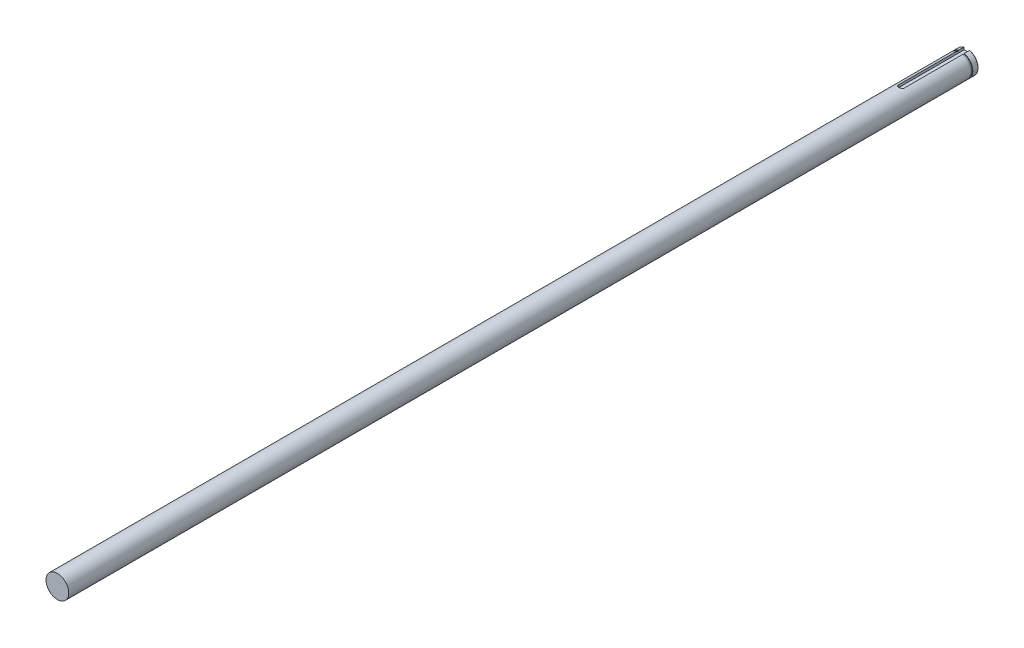
ISO-10303-21;
HEADER;
FILE_DESCRIPTION(('STEP AP214'),'2;1');
FILE_NAME('part.step','',(''),(''),'','','');
FILE_SCHEMA(('AUTOMOTIVE_DESIGN { 1 0 10303 214 1 1 1 1 }'));
ENDSEC;
DATA;
#1=APPLICATION_CONTEXT('core data for automotive mechanical design processes');
#2=APPLICATION_PROTOCOL_DEFINITION('international standard','automotive_design',2000,#1);
#3=PRODUCT_CONTEXT('',#1,'mechanical');
#4=PRODUCT('Part','Part','',(#3));
#5=PRODUCT_RELATED_PRODUCT_CATEGORY('part','',(#4));
#6=PRODUCT_DEFINITION_FORMATION('','',#4);
#7=PRODUCT_DEFINITION_CONTEXT('part definition',#1,'design');
#8=PRODUCT_DEFINITION('design','',#6,#7);
#9=PRODUCT_DEFINITION_SHAPE('','',#8);
#10=(LENGTH_UNIT() NAMED_UNIT(*) SI_UNIT(.MILLI.,.METRE.));
#11=(NAMED_UNIT(*) PLANE_ANGLE_UNIT() SI_UNIT($,.RADIAN.));
#12=(NAMED_UNIT(*) SI_UNIT($,.STERADIAN.) SOLID_ANGLE_UNIT());
#13=UNCERTAINTY_MEASURE_WITH_UNIT(LENGTH_MEASURE(1.E-05),#10,'distance_accuracy_value','');
#14=(GEOMETRIC_REPRESENTATION_CONTEXT(3) GLOBAL_UNCERTAINTY_ASSIGNED_CONTEXT((#13)) GLOBAL_UNIT_ASSIGNED_CONTEXT((#10,
#11,#12)) REPRESENTATION_CONTEXT('',''));
#15=CARTESIAN_POINT('',(0.,0.,0.));
#16=DIRECTION('',(0.,0.,1.));
#17=DIRECTION('',(1.,0.,0.));
#18=AXIS2_PLACEMENT_3D('',#15,#16,#17);
#19=CARTESIAN_POINT('',(0.,0.,508.));
#20=DIRECTION('',(0.,0.,-1.));
#21=DIRECTION('',(-1.,0.,0.));
#22=AXIS2_PLACEMENT_3D('',#19,#20,#21);
#23=CYLINDRICAL_SURFACE('',#22,6.35);
#24=CARTESIAN_POINT('',(0.,0.,508.));
#25=DIRECTION('',(0.,0.,1.));
#26=DIRECTION('',(1.,0.,0.));
#27=AXIS2_PLACEMENT_3D('',#24,#25,#26);
#28=CIRCLE('',#27,6.35);
#29=CARTESIAN_POINT('',(6.35,0.,508.));
#30=VERTEX_POINT('',#29);
#31=EDGE_CURVE('E160',#30,#30,#28,.T.);
#32=ORIENTED_EDGE('',*,*,#31,.F.);
#33=EDGE_LOOP('',(#32));
#34=FACE_BOUND('',#33,.T.);
#35=CARTESIAN_POINT('',(0.,0.,4.16559999999999));
#36=DIRECTION('',(0.,0.,-1.));
#37=DIRECTION('',(-1.,0.,0.));
#38=AXIS2_PLACEMENT_3D('',#35,#36,#37);
#39=CIRCLE('',#38,6.35);
#40=CARTESIAN_POINT('',(1.5875,6.14836106210427,4.1656));
#41=VERTEX_POINT('',#40);
#42=CARTESIAN_POINT('',(-1.5875,6.14836106210428,4.16559999999999));
#43=VERTEX_POINT('',#42);
#44=EDGE_CURVE('E119',#41,#43,#39,.T.);
#45=ORIENTED_EDGE('',*,*,#44,.F.);
#46=DIRECTION('',(0.,0.,-1.));
#47=VECTOR('',#46,1.);
#48=CARTESIAN_POINT('',(1.5875,6.14836106210427,508.));
#49=LINE('',#48,#47);
#50=CARTESIAN_POINT('',(1.5875,6.14836106210427,36.5125));
#51=VERTEX_POINT('',#50);
#52=EDGE_CURVE('E153',#41,#51,#49,.F.);
#53=ORIENTED_EDGE('',*,*,#52,.T.);
#54=CARTESIAN_POINT('',(1.5875,6.14836106210427,36.5125));
#55=CARTESIAN_POINT('',(1.58750053563076,6.14835810796606,36.5564164042586));
#56=CARTESIAN_POINT('',(1.58567649135611,6.1488321882052,36.6003110486267));
#57=CARTESIAN_POINT('',(1.57840509610179,6.15070388893621,36.6877720323265));
#58=CARTESIAN_POINT('',(1.57295835523029,6.15210135391809,36.7313384256906));
#59=CARTESIAN_POINT('',(1.55126429791882,6.15762251223385,36.8608874085666));
#60=CARTESIAN_POINT('',(1.52966278974207,6.16307532290946,36.9459798107256));
#61=CARTESIAN_POINT('',(1.47287988261591,6.17688972981619,37.1111841775605));
#62=CARTESIAN_POINT('',(1.43769952552689,6.18525110287803,37.1912965237924));
#63=CARTESIAN_POINT('',(1.35479829949004,6.20393595252303,37.3445247417086));
#64=CARTESIAN_POINT('',(1.30707369385798,6.2142600134982,37.4176385197897));
#65=CARTESIAN_POINT('',(1.19933256749028,6.23595799608254,37.556349844211));
#66=CARTESIAN_POINT('',(1.13909280637801,6.24734856924931,37.6217713342527));
#67=CARTESIAN_POINT('',(1.00850181854161,6.26975322519149,37.7417030245693));
#68=CARTESIAN_POINT('',(0.938148677552545,6.2807672362014,37.7962111544744));
#69=CARTESIAN_POINT('',(0.788105723384315,6.30136480507554,37.8934975279442));
#70=CARTESIAN_POINT('',(0.708297348786843,6.31092579003164,37.9360979144321));
#71=CARTESIAN_POINT('',(0.542394374747519,6.3273403202671,38.0071884375914));
#72=CARTESIAN_POINT('',(0.4563046932846,6.33419595732182,38.035689480219));
#73=CARTESIAN_POINT('',(0.308130870380598,6.34280700011213,38.0710419259421));
#74=CARTESIAN_POINT('',(0.247023133427687,6.3454886220384,38.0818844479464));
#75=CARTESIAN_POINT('',(0.12395437707704,6.34909193923033,38.0963679483237));
#76=CARTESIAN_POINT('',(0.0619939974411806,6.35001488853225,38.100014058225));
#77=CARTESIAN_POINT('',(0.,6.35,38.1));
#78=B_SPLINE_CURVE_WITH_KNOTS('',3,(#54,#55,#56,#57,#58,#59,#60,#61,#62,#63,#64,#65,#66,#67,#68,
#69,#70,#71,#72,#73,#74,#75,#76,#77),.UNSPECIFIED.,.F.,.F.,(4,2,2,2,2,2,2,2,2,2,2,4),(0.,
0.131665984878253,0.263309801142852,0.525827589053098,0.788325238840119,1.05090117028931,
1.31864004112946,1.58642965659114,1.8580279681483,2.12941586644515,2.3153533887735,
2.50115827710588),.UNSPECIFIED.);
#79=CARTESIAN_POINT('',(0.,6.35,38.1));
#80=VERTEX_POINT('',#79);
#81=EDGE_CURVE('E11',#51,#80,#78,.T.);
#82=ORIENTED_EDGE('',*,*,#81,.T.);
#83=CARTESIAN_POINT('',(0.,6.35,38.1));
#84=CARTESIAN_POINT('',(-0.0439381419439138,6.35000250540312,38.1000004773171));
#85=CARTESIAN_POINT('',(-0.0878545966592341,6.34954340403385,38.0981746816886));
#86=CARTESIAN_POINT('',(-0.175360439570217,6.3477286591364,38.090895931349));
#87=CARTESIAN_POINT('',(-0.218949877602366,6.34637315514478,38.0854435411632));
#88=CARTESIAN_POINT('',(-0.34857618129887,6.34101201422056,38.063725013765));
#89=CARTESIAN_POINT('',(-0.433724473320642,6.33571144551056,38.0420971780461));
#90=CARTESIAN_POINT('',(-0.599043829778521,6.32222636565126,37.9852376852895));
#91=CARTESIAN_POINT('',(-0.679214994295192,6.31404191251351,37.9500063018962));
#92=CARTESIAN_POINT('',(-0.832540768645135,6.29566048497806,37.8669857312186));
#93=CARTESIAN_POINT('',(-0.905693540832324,6.28546298562404,37.8191932672127));
#94=CARTESIAN_POINT('',(-1.0443626413639,6.26393073756774,37.711382214892));
#95=CARTESIAN_POINT('',(-1.1097145404664,6.25257857860382,37.6511557066594));
#96=CARTESIAN_POINT('',(-1.22951149389981,6.23013032507566,37.520620145661));
#97=CARTESIAN_POINT('',(-1.28395413289799,6.21903428769736,37.4503088660052));
#98=CARTESIAN_POINT('',(-1.3811687665937,6.19817637949513,37.300306027469));
#99=CARTESIAN_POINT('',(-1.42375170417231,6.18843723686723,37.2204886309121));
#100=CARTESIAN_POINT('',(-1.49480670969855,6.17166052854814,37.0545680899359));
#101=CARTESIAN_POINT('',(-1.52329018676586,6.164620779582,36.9684700926547));
#102=CARTESIAN_POINT('',(-1.55859600850025,6.15576968025138,36.8203439536311));
#103=CARTESIAN_POINT('',(-1.56941770251178,6.15300939882428,36.7592962159982));
#104=CARTESIAN_POINT('',(-1.58387443533482,6.14929724452326,36.6363433418623));
#105=CARTESIAN_POINT('',(-1.58751417787204,6.14834418804682,36.5744387932915));
#106=CARTESIAN_POINT('',(-1.5875,6.14836106210428,36.5125));
#107=B_SPLINE_CURVE_WITH_KNOTS('',3,(#83,#84,#85,#86,#87,#88,#89,#90,#91,#92,#93,#94,#95,#96,
#97,#98,#99,#100,#101,#102,#103,#104,#105,#106),.UNSPECIFIED.,.F.,.F.,(4,2,2,2,2,2,2,2,2,2,2,4),
(0.,0.131731399473638,0.263442298089413,0.526113689422091,0.788779797220858,1.05151449302482,
1.31906192516595,1.58666852757008,1.85832436810619,2.1297600270756,2.31551982828806,
2.50115792810002),.UNSPECIFIED.);
#108=CARTESIAN_POINT('',(-1.5875,6.14836106210427,36.5125));
#109=VERTEX_POINT('',#108);
#110=EDGE_CURVE('E43',#80,#109,#107,.T.);
#111=ORIENTED_EDGE('',*,*,#110,.T.);
#112=DIRECTION('',(0.,0.,-1.));
#113=VECTOR('',#112,1.);
#114=CARTESIAN_POINT('',(-1.5875,6.14836106210427,508.));
#115=LINE('',#114,#113);
#116=EDGE_CURVE('E158',#109,#43,#115,.T.);
#117=ORIENTED_EDGE('',*,*,#116,.T.);
#118=EDGE_LOOP('',(#45,#53,#82,#111,#117));
#119=FACE_BOUND('',#118,.T.);
#120=ADVANCED_FACE('F33',(#34,#119),#23,.T.);
#121=CARTESIAN_POINT('',(-1.5875,4.7625,38.1));
#122=DIRECTION('',(-1.,0.,0.));
#123=DIRECTION('',(0.,0.,1.));
#124=AXIS2_PLACEMENT_3D('',#121,#122,#123);
#125=PLANE('',#124);
#126=ORIENTED_EDGE('',*,*,#116,.F.);
#127=DIRECTION('',(0.,1.,0.));
#128=VECTOR('',#127,1.);
#129=CARTESIAN_POINT('',(-1.5875,4.7625,36.5125));
#130=LINE('',#129,#128);
#131=CARTESIAN_POINT('',(-1.5875,4.7625,36.5125));
#132=VERTEX_POINT('',#131);
#133=EDGE_CURVE('E205',#109,#132,#130,.F.);
#134=ORIENTED_EDGE('',*,*,#133,.T.);
#135=DIRECTION('',(0.,0.,-1.));
#136=VECTOR('',#135,1.);
#137=CARTESIAN_POINT('',(-1.5875,4.7625,38.1));
#138=LINE('',#137,#136);
#139=CARTESIAN_POINT('',(-1.5875,4.7625,0.));
#140=VERTEX_POINT('',#139);
#141=EDGE_CURVE('E151',#132,#140,#138,.T.);
#142=ORIENTED_EDGE('',*,*,#141,.T.);
#143=DIRECTION('',(0.,1.,0.));
#144=VECTOR('',#143,1.);
#145=CARTESIAN_POINT('',(-1.5875,4.7625,0.));
#146=LINE('',#145,#144);
#147=CARTESIAN_POINT('',(-1.5875,5.88566561656356,0.));
#148=VERTEX_POINT('',#147);
#149=EDGE_CURVE('E123',#140,#148,#146,.T.);
#150=ORIENTED_EDGE('',*,*,#149,.T.);
#151=CARTESIAN_POINT('',(-1.5875,5.88566561656356,0.));
#152=CARTESIAN_POINT('',(-1.5875,5.92947825650988,0.0423022385993529));
#153=CARTESIAN_POINT('',(-1.5875,5.97327586366772,0.0846200246202157));
#154=CARTESIAN_POINT('',(-1.5875,6.06084101218114,0.169286691287072));
#155=CARTESIAN_POINT('',(-1.5875,6.10460855353686,0.211635571932905));
#156=CARTESIAN_POINT('',(-1.5875,6.14836106210428,0.254000000000088));
#157=B_SPLINE_CURVE_WITH_KNOTS('',3,(#151,#152,#153,#154,#155,#156),.UNSPECIFIED.,.F.,.F.,(4,2,
4),(0.,0.182705305500814,0.365410610061245),.UNSPECIFIED.);
#158=CARTESIAN_POINT('',(-1.5875,6.14836106210427,0.254000000000086));
#159=VERTEX_POINT('',#158);
#160=EDGE_CURVE('E200',#148,#159,#157,.T.);
#161=ORIENTED_EDGE('',*,*,#160,.T.);
#162=CARTESIAN_POINT('',(-1.5875,6.14836106210428,3.17500000000004));
#163=VERTEX_POINT('',#162);
#164=EDGE_CURVE('E157',#163,#159,#115,.T.);
#165=ORIENTED_EDGE('',*,*,#164,.F.);
#166=DIRECTION('',(0.,-1.,0.));
#167=VECTOR('',#166,1.);
#168=CARTESIAN_POINT('',(-1.5875,4.7625,3.175));
#169=LINE('',#168,#167);
#170=CARTESIAN_POINT('',(-1.5875,5.72767184028555,3.175));
#171=VERTEX_POINT('',#170);
#172=EDGE_CURVE('E136',#163,#171,#169,.T.);
#173=ORIENTED_EDGE('',*,*,#172,.T.);
#174=DIRECTION('',(0.,0.,-1.));
#175=VECTOR('',#174,1.);
#176=CARTESIAN_POINT('',(-1.5875,5.72767184028554,4.1656));
#177=LINE('',#176,#175);
#178=CARTESIAN_POINT('',(-1.5875,5.72767184028555,4.1656));
#179=VERTEX_POINT('',#178);
#180=EDGE_CURVE('E127',#179,#171,#177,.T.);
#181=ORIENTED_EDGE('',*,*,#180,.F.);
#182=DIRECTION('',(0.,-1.,0.));
#183=VECTOR('',#182,1.);
#184=CARTESIAN_POINT('',(-1.5875,4.7625,4.1656));
#185=LINE('',#184,#183);
#186=EDGE_CURVE('E113',#43,#179,#185,.T.);
#187=ORIENTED_EDGE('',*,*,#186,.F.);
#188=EDGE_LOOP('',(#126,#134,#142,#150,#161,#165,#173,#181,#187));
#189=FACE_BOUND('',#188,.T.);
#190=ADVANCED_FACE('F134',(#189),#125,.F.);
#191=CARTESIAN_POINT('',(1.5875,4.7625,38.1));
#192=DIRECTION('',(1.,0.,0.));
#193=DIRECTION('',(0.,0.,-1.));
#194=AXIS2_PLACEMENT_3D('',#191,#192,#193);
#195=PLANE('',#194);
#196=DIRECTION('',(0.,0.,-1.));
#197=VECTOR('',#196,1.);
#198=CARTESIAN_POINT('',(1.5875,4.7625,38.1));
#199=LINE('',#198,#197);
#200=CARTESIAN_POINT('',(1.5875,4.7625,36.5125));
#201=VERTEX_POINT('',#200);
#202=CARTESIAN_POINT('',(1.5875,4.7625,0.));
#203=VERTEX_POINT('',#202);
#204=EDGE_CURVE('E150',#201,#203,#199,.T.);
#205=ORIENTED_EDGE('',*,*,#204,.F.);
#206=DIRECTION('',(0.,-1.,0.));
#207=VECTOR('',#206,1.);
#208=CARTESIAN_POINT('',(1.5875,6.14836106210427,36.5125));
#209=LINE('',#208,#207);
#210=EDGE_CURVE('E56',#201,#51,#209,.F.);
#211=ORIENTED_EDGE('',*,*,#210,.T.);
#212=ORIENTED_EDGE('',*,*,#52,.F.);
#213=DIRECTION('',(0.,1.,0.));
#214=VECTOR('',#213,1.);
#215=CARTESIAN_POINT('',(1.5875,4.7625,4.1656));
#216=LINE('',#215,#214);
#217=CARTESIAN_POINT('',(1.5875,5.72767184028555,4.1656));
#218=VERTEX_POINT('',#217);
#219=EDGE_CURVE('E170',#218,#41,#216,.T.);
#220=ORIENTED_EDGE('',*,*,#219,.F.);
#221=DIRECTION('',(0.,0.,-1.));
#222=VECTOR('',#221,1.);
#223=CARTESIAN_POINT('',(1.5875,5.72767184028554,4.1656));
#224=LINE('',#223,#222);
#225=CARTESIAN_POINT('',(1.5875,5.72767184028554,3.175));
#226=VERTEX_POINT('',#225);
#227=EDGE_CURVE('E130',#226,#218,#224,.F.);
#228=ORIENTED_EDGE('',*,*,#227,.F.);
#229=DIRECTION('',(0.,1.,0.));
#230=VECTOR('',#229,1.);
#231=CARTESIAN_POINT('',(1.5875,4.7625,3.175));
#232=LINE('',#231,#230);
#233=CARTESIAN_POINT('',(1.5875,6.14836106210427,3.175));
#234=VERTEX_POINT('',#233);
#235=EDGE_CURVE('E167',#226,#234,#232,.T.);
#236=ORIENTED_EDGE('',*,*,#235,.T.);
#237=CARTESIAN_POINT('',(1.5875,6.14836106210427,0.254000000000086));
#238=VERTEX_POINT('',#237);
#239=EDGE_CURVE('E155',#238,#234,#49,.F.);
#240=ORIENTED_EDGE('',*,*,#239,.F.);
#241=CARTESIAN_POINT('',(1.5875,6.14836106210427,0.254000000000087));
#242=CARTESIAN_POINT('',(1.5875,6.10460855353686,0.211635571932905));
#243=CARTESIAN_POINT('',(1.5875,6.06084101218114,0.169286691287072));
#244=CARTESIAN_POINT('',(1.5875,5.97327586366772,0.0846200246202163));
#245=CARTESIAN_POINT('',(1.5875,5.92947825650988,0.0423022385993534));
#246=CARTESIAN_POINT('',(1.5875,5.88566561656356,0.));
#247=B_SPLINE_CURVE_WITH_KNOTS('',3,(#241,#242,#243,#244,#245,#246),.UNSPECIFIED.,.F.,.F.,(4,2,
4),(0.,0.18270530456043,0.365410610061243),.UNSPECIFIED.);
#248=CARTESIAN_POINT('',(1.5875,5.88566561656356,0.));
#249=VERTEX_POINT('',#248);
#250=EDGE_CURVE('E175',#238,#249,#247,.T.);
#251=ORIENTED_EDGE('',*,*,#250,.T.);
#252=DIRECTION('',(0.,1.,0.));
#253=VECTOR('',#252,1.);
#254=CARTESIAN_POINT('',(1.5875,0.,0.));
#255=LINE('',#254,#253);
#256=EDGE_CURVE('E163',#203,#249,#255,.T.);
#257=ORIENTED_EDGE('',*,*,#256,.F.);
#258=EDGE_LOOP('',(#205,#211,#212,#220,#228,#236,#240,#251,#257));
#259=FACE_BOUND('',#258,.T.);
#260=ADVANCED_FACE('F187',(#259),#195,.F.);
#261=ORIENTED_EDGE('',*,*,#164,.T.);
#262=CARTESIAN_POINT('',(0.,0.,0.254000000000087));
#263=DIRECTION('',(0.,0.,1.));
#264=DIRECTION('',(1.,0.,0.));
#265=AXIS2_PLACEMENT_3D('',#262,#263,#264);
#266=CIRCLE('',#265,6.35);
#267=EDGE_CURVE('E172',#159,#238,#266,.T.);
#268=ORIENTED_EDGE('',*,*,#267,.T.);
#269=ORIENTED_EDGE('',*,*,#239,.T.);
#270=CARTESIAN_POINT('',(0.,0.,3.17500000000004));
#271=DIRECTION('',(0.,0.,-1.));
#272=DIRECTION('',(-1.,0.,0.));
#273=AXIS2_PLACEMENT_3D('',#270,#271,#272);
#274=CIRCLE('',#273,6.35);
#275=EDGE_CURVE('E137',#234,#163,#274,.T.);
#276=ORIENTED_EDGE('',*,*,#275,.T.);
#277=EDGE_LOOP('',(#261,#268,#269,#276));
#278=FACE_BOUND('',#277,.T.);
#279=ADVANCED_FACE('F192',(#278),#23,.T.);
#280=CARTESIAN_POINT('',(0.,0.,508.));
#281=DIRECTION('',(0.,0.,1.));
#282=DIRECTION('',(1.,0.,0.));
#283=AXIS2_PLACEMENT_3D('',#280,#281,#282);
#284=PLANE('',#283);
#285=ORIENTED_EDGE('',*,*,#31,.T.);
#286=EDGE_LOOP('',(#285));
#287=FACE_BOUND('',#286,.T.);
#288=ADVANCED_FACE('F198',(#287),#284,.T.);
#289=CARTESIAN_POINT('',(0.,0.,0.));
#290=DIRECTION('',(0.,0.,1.));
#291=DIRECTION('',(1.,0.,0.));
#292=AXIS2_PLACEMENT_3D('',#289,#290,#291);
#293=PLANE('',#292);
#294=ORIENTED_EDGE('',*,*,#256,.T.);
#295=CARTESIAN_POINT('',(0.,0.,0.));
#296=DIRECTION('',(0.,0.,1.));
#297=DIRECTION('',(1.,0.,0.));
#298=AXIS2_PLACEMENT_3D('',#295,#296,#297);
#299=CIRCLE('',#298,6.09599999999988);
#300=EDGE_CURVE('E182',#249,#148,#299,.F.);
#301=ORIENTED_EDGE('',*,*,#300,.T.);
#302=ORIENTED_EDGE('',*,*,#149,.F.);
#303=DIRECTION('',(-1.,0.,0.));
#304=VECTOR('',#303,1.);
#305=CARTESIAN_POINT('',(1.5875,4.7625,0.));
#306=LINE('',#305,#304);
#307=EDGE_CURVE('E147',#203,#140,#306,.T.);
#308=ORIENTED_EDGE('',*,*,#307,.F.);
#309=EDGE_LOOP('',(#294,#301,#302,#308));
#310=FACE_BOUND('',#309,.T.);
#311=ADVANCED_FACE('F238',(#310),#293,.F.);
#312=CARTESIAN_POINT('',(1.5875,4.7625,38.1));
#313=DIRECTION('',(0.,-1.,0.));
#314=DIRECTION('',(0.,0.,-1.));
#315=AXIS2_PLACEMENT_3D('',#312,#313,#314);
#316=PLANE('',#315);
#317=ORIENTED_EDGE('',*,*,#141,.F.);
#318=CARTESIAN_POINT('',(0.,4.7625,36.5125));
#319=DIRECTION('',(0.,-1.,0.));
#320=DIRECTION('',(0.,0.,-1.));
#321=AXIS2_PLACEMENT_3D('',#318,#319,#320);
#322=CIRCLE('',#321,1.5875);
#323=CARTESIAN_POINT('',(0.,4.7625,38.1));
#324=VERTEX_POINT('',#323);
#325=EDGE_CURVE('E210',#132,#324,#322,.F.);
#326=ORIENTED_EDGE('',*,*,#325,.T.);
#327=CARTESIAN_POINT('',(0.,4.7625,36.5125));
#328=DIRECTION('',(0.,-1.,0.));
#329=DIRECTION('',(0.,0.,-1.));
#330=AXIS2_PLACEMENT_3D('',#327,#328,#329);
#331=CIRCLE('',#330,1.5875);
#332=EDGE_CURVE('E208',#324,#201,#331,.F.);
#333=ORIENTED_EDGE('',*,*,#332,.T.);
#334=ORIENTED_EDGE('',*,*,#204,.T.);
#335=ORIENTED_EDGE('',*,*,#307,.T.);
#336=EDGE_LOOP('',(#317,#326,#333,#334,#335));
#337=FACE_BOUND('',#336,.T.);
#338=ADVANCED_FACE('F193',(#337),#316,.F.);
#339=CARTESIAN_POINT('',(0.,0.,4.1656));
#340=DIRECTION('',(0.,0.,-1.));
#341=DIRECTION('',(-1.,0.,0.));
#342=AXIS2_PLACEMENT_3D('',#339,#340,#341);
#343=PLANE('',#342);
#344=ORIENTED_EDGE('',*,*,#186,.T.);
#345=CARTESIAN_POINT('',(0.,0.,4.1656));
#346=DIRECTION('',(0.,0.,-1.));
#347=DIRECTION('',(-1.,0.,0.));
#348=AXIS2_PLACEMENT_3D('',#345,#346,#347);
#349=CIRCLE('',#348,5.9436);
#350=EDGE_CURVE('E116',#218,#179,#349,.T.);
#351=ORIENTED_EDGE('',*,*,#350,.F.);
#352=ORIENTED_EDGE('',*,*,#219,.T.);
#353=ORIENTED_EDGE('',*,*,#44,.T.);
#354=EDGE_LOOP('',(#344,#351,#352,#353));
#355=FACE_BOUND('',#354,.T.);
#356=ADVANCED_FACE('F115',(#355),#343,.T.);
#357=CARTESIAN_POINT('',(0.,0.,3.175));
#358=DIRECTION('',(0.,0.,-1.));
#359=DIRECTION('',(-1.,0.,0.));
#360=AXIS2_PLACEMENT_3D('',#357,#358,#359);
#361=PLANE('',#360);
#362=ORIENTED_EDGE('',*,*,#275,.F.);
#363=ORIENTED_EDGE('',*,*,#235,.F.);
#364=CARTESIAN_POINT('',(0.,0.,3.175));
#365=DIRECTION('',(0.,0.,-1.));
#366=DIRECTION('',(-1.,0.,0.));
#367=AXIS2_PLACEMENT_3D('',#364,#365,#366);
#368=CIRCLE('',#367,5.9436);
#369=EDGE_CURVE('E131',#226,#171,#368,.T.);
#370=ORIENTED_EDGE('',*,*,#369,.T.);
#371=ORIENTED_EDGE('',*,*,#172,.F.);
#372=EDGE_LOOP('',(#362,#363,#370,#371));
#373=FACE_BOUND('',#372,.T.);
#374=ADVANCED_FACE('F259',(#373),#361,.F.);
#375=CARTESIAN_POINT('',(0.,0.,4.1656));
#376=DIRECTION('',(0.,0.,-1.));
#377=DIRECTION('',(-1.,0.,0.));
#378=AXIS2_PLACEMENT_3D('',#375,#376,#377);
#379=CYLINDRICAL_SURFACE('',#378,5.9436);
#380=ORIENTED_EDGE('',*,*,#180,.T.);
#381=ORIENTED_EDGE('',*,*,#369,.F.);
#382=ORIENTED_EDGE('',*,*,#227,.T.);
#383=ORIENTED_EDGE('',*,*,#350,.T.);
#384=EDGE_LOOP('',(#380,#381,#382,#383));
#385=FACE_BOUND('',#384,.T.);
#386=ADVANCED_FACE('F126',(#385),#379,.T.);
#387=CARTESIAN_POINT('',(0.,0.,0.254000000000087));
#388=DIRECTION('',(0.,0.,1.));
#389=DIRECTION('',(1.,0.,0.));
#390=AXIS2_PLACEMENT_3D('',#387,#388,#389);
#391=CONICAL_SURFACE('',#390,6.35,0.785398163397511);
#392=ORIENTED_EDGE('',*,*,#160,.F.);
#393=ORIENTED_EDGE('',*,*,#300,.F.);
#394=ORIENTED_EDGE('',*,*,#250,.F.);
#395=ORIENTED_EDGE('',*,*,#267,.F.);
#396=EDGE_LOOP('',(#392,#393,#394,#395));
#397=FACE_BOUND('',#396,.T.);
#398=ADVANCED_FACE('F184',(#397),#391,.T.);
#399=CARTESIAN_POINT('',(0.,0.,36.5125));
#400=DIRECTION('',(0.,1.,0.));
#401=DIRECTION('',(0.,0.,1.));
#402=AXIS2_PLACEMENT_3D('',#399,#400,#401);
#403=CYLINDRICAL_SURFACE('',#402,1.5875);
#404=ORIENTED_EDGE('',*,*,#210,.F.);
#405=ORIENTED_EDGE('',*,*,#332,.F.);
#406=DIRECTION('',(0.,-1.,0.));
#407=VECTOR('',#406,1.);
#408=CARTESIAN_POINT('',(0.,4.7625,38.1));
#409=LINE('',#408,#407);
#410=EDGE_CURVE('E38',#80,#324,#409,.T.);
#411=ORIENTED_EDGE('',*,*,#410,.F.);
#412=ORIENTED_EDGE('',*,*,#81,.F.);
#413=EDGE_LOOP('',(#404,#405,#411,#412));
#414=FACE_BOUND('',#413,.T.);
#415=ADVANCED_FACE('F35',(#414),#403,.F.);
#416=CARTESIAN_POINT('',(0.,0.,36.5125));
#417=DIRECTION('',(0.,-1.,0.));
#418=DIRECTION('',(0.,0.,-1.));
#419=AXIS2_PLACEMENT_3D('',#416,#417,#418);
#420=CYLINDRICAL_SURFACE('',#419,1.5875);
#421=ORIENTED_EDGE('',*,*,#325,.F.);
#422=ORIENTED_EDGE('',*,*,#133,.F.);
#423=ORIENTED_EDGE('',*,*,#110,.F.);
#424=ORIENTED_EDGE('',*,*,#410,.T.);
#425=EDGE_LOOP('',(#421,#422,#423,#424));
#426=FACE_BOUND('',#425,.T.);
#427=ADVANCED_FACE('F220',(#426),#420,.F.);
#428=CLOSED_SHELL('',(#120,#190,#260,#279,#288,#311,#338,#356,#374,#386,#398,#415,#427));
#429=MANIFOLD_SOLID_BREP('B2',#428);
#430=ADVANCED_BREP_SHAPE_REPRESENTATION('',(#18,#429),#14);
#431=SHAPE_DEFINITION_REPRESENTATION(#9,#430);
ENDSEC;
END-ISO-10303-21;
